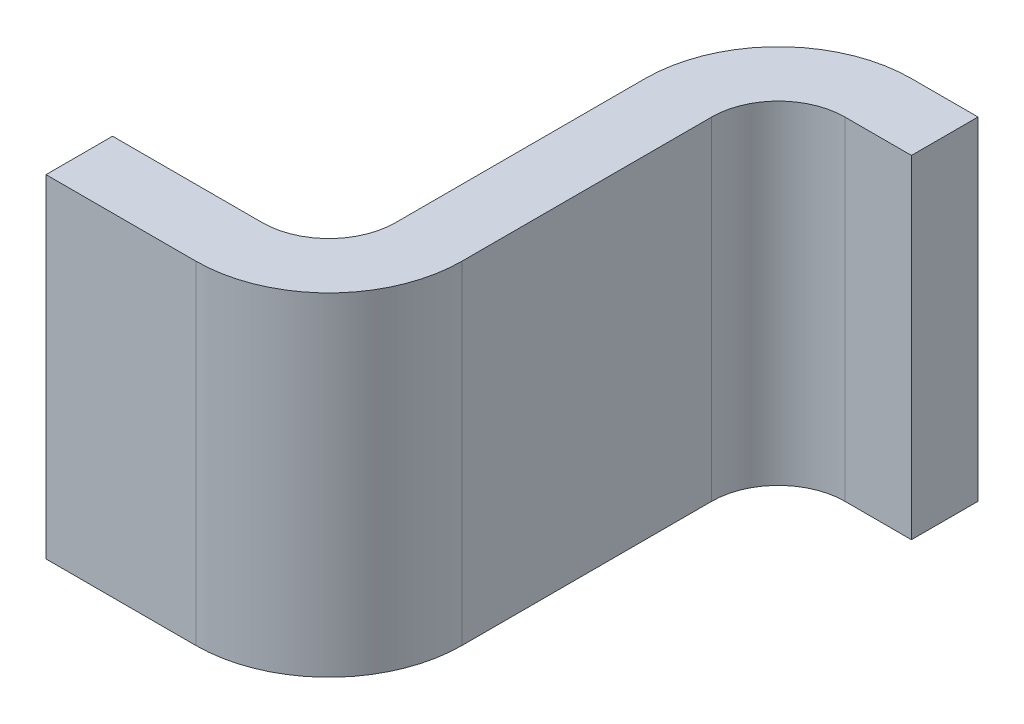
ISO-10303-21;
HEADER;
FILE_DESCRIPTION(('STEP AP214'),'2;1');
FILE_NAME('part.step','',(''),(''),'','','');
FILE_SCHEMA(('AUTOMOTIVE_DESIGN { 1 0 10303 214 1 1 1 1 }'));
ENDSEC;
DATA;
#1=APPLICATION_CONTEXT('core data for automotive mechanical design processes');
#2=APPLICATION_PROTOCOL_DEFINITION('international standard','automotive_design',2000,#1);
#3=PRODUCT_CONTEXT('',#1,'mechanical');
#4=PRODUCT('Part','Part','',(#3));
#5=PRODUCT_RELATED_PRODUCT_CATEGORY('part','',(#4));
#6=PRODUCT_DEFINITION_FORMATION('','',#4);
#7=PRODUCT_DEFINITION_CONTEXT('part definition',#1,'design');
#8=PRODUCT_DEFINITION('design','',#6,#7);
#9=PRODUCT_DEFINITION_SHAPE('','',#8);
#10=(LENGTH_UNIT() NAMED_UNIT(*) SI_UNIT(.MILLI.,.METRE.));
#11=(NAMED_UNIT(*) PLANE_ANGLE_UNIT() SI_UNIT($,.RADIAN.));
#12=(NAMED_UNIT(*) SI_UNIT($,.STERADIAN.) SOLID_ANGLE_UNIT());
#13=UNCERTAINTY_MEASURE_WITH_UNIT(LENGTH_MEASURE(1.E-05),#10,'distance_accuracy_value','');
#14=(GEOMETRIC_REPRESENTATION_CONTEXT(3) GLOBAL_UNCERTAINTY_ASSIGNED_CONTEXT((#13)) GLOBAL_UNIT_ASSIGNED_CONTEXT((#10,
#11,#12)) REPRESENTATION_CONTEXT('',''));
#15=CARTESIAN_POINT('',(0.,0.,0.));
#16=DIRECTION('',(0.,0.,1.));
#17=DIRECTION('',(1.,0.,0.));
#18=AXIS2_PLACEMENT_3D('',#15,#16,#17);
#19=CARTESIAN_POINT('',(0.,0.25,0.775));
#20=DIRECTION('',(0.,0.,-1.));
#21=DIRECTION('',(-1.,0.,0.));
#22=AXIS2_PLACEMENT_3D('',#19,#20,#21);
#23=PLANE('',#22);
#24=DIRECTION('',(1.,0.,0.));
#25=VECTOR('',#24,1.);
#26=CARTESIAN_POINT('',(0.,0.25,0.775));
#27=LINE('',#26,#25);
#28=CARTESIAN_POINT('',(0.225,0.25,0.775));
#29=VERTEX_POINT('',#28);
#30=CARTESIAN_POINT('',(0.,0.25,0.775));
#31=VERTEX_POINT('',#30);
#32=EDGE_CURVE('E85',#29,#31,#27,.F.);
#33=ORIENTED_EDGE('',*,*,#32,.T.);
#34=DIRECTION('',(0.,1.,0.));
#35=VECTOR('',#34,1.);
#36=CARTESIAN_POINT('',(0.,-0.25,0.775));
#37=LINE('',#36,#35);
#38=CARTESIAN_POINT('',(0.,-0.25,0.775));
#39=VERTEX_POINT('',#38);
#40=EDGE_CURVE('E111',#39,#31,#37,.T.);
#41=ORIENTED_EDGE('',*,*,#40,.F.);
#42=DIRECTION('',(1.,0.,0.));
#43=VECTOR('',#42,1.);
#44=CARTESIAN_POINT('',(0.,-0.25,0.775));
#45=LINE('',#44,#43);
#46=CARTESIAN_POINT('',(0.225,-0.25,0.775));
#47=VERTEX_POINT('',#46);
#48=EDGE_CURVE('E130',#39,#47,#45,.T.);
#49=ORIENTED_EDGE('',*,*,#48,.T.);
#50=DIRECTION('',(0.,1.,0.));
#51=VECTOR('',#50,1.);
#52=CARTESIAN_POINT('',(0.225,0.25,0.775));
#53=LINE('',#52,#51);
#54=EDGE_CURVE('E121',#29,#47,#53,.F.);
#55=ORIENTED_EDGE('',*,*,#54,.F.);
#56=EDGE_LOOP('',(#33,#41,#49,#55));
#57=FACE_BOUND('',#56,.T.);
#58=ADVANCED_FACE('F17',(#57),#23,.F.);
#59=CARTESIAN_POINT('',(0.525,0.25,0.1));
#60=DIRECTION('',(0.,0.,-1.));
#61=DIRECTION('',(-1.,0.,0.));
#62=AXIS2_PLACEMENT_3D('',#59,#60,#61);
#63=PLANE('',#62);
#64=DIRECTION('',(1.,0.,0.));
#65=VECTOR('',#64,1.);
#66=CARTESIAN_POINT('',(0.525,0.25,0.1));
#67=LINE('',#66,#65);
#68=CARTESIAN_POINT('',(0.625,0.25,0.1));
#69=VERTEX_POINT('',#68);
#70=CARTESIAN_POINT('',(0.525,0.25,0.1));
#71=VERTEX_POINT('',#70);
#72=EDGE_CURVE('E142',#69,#71,#67,.F.);
#73=ORIENTED_EDGE('',*,*,#72,.T.);
#74=DIRECTION('',(0.,-1.,0.));
#75=VECTOR('',#74,1.);
#76=CARTESIAN_POINT('',(0.525,0.25,0.1));
#77=LINE('',#76,#75);
#78=CARTESIAN_POINT('',(0.525,-0.25,0.1));
#79=VERTEX_POINT('',#78);
#80=EDGE_CURVE('E189',#71,#79,#77,.T.);
#81=ORIENTED_EDGE('',*,*,#80,.T.);
#82=DIRECTION('',(1.,0.,0.));
#83=VECTOR('',#82,1.);
#84=CARTESIAN_POINT('',(0.525,-0.25,0.1));
#85=LINE('',#84,#83);
#86=CARTESIAN_POINT('',(0.625,-0.25,0.1));
#87=VERTEX_POINT('',#86);
#88=EDGE_CURVE('E193',#79,#87,#85,.T.);
#89=ORIENTED_EDGE('',*,*,#88,.T.);
#90=DIRECTION('',(0.,1.,0.));
#91=VECTOR('',#90,1.);
#92=CARTESIAN_POINT('',(0.625,-0.25,0.1));
#93=LINE('',#92,#91);
#94=EDGE_CURVE('E96',#87,#69,#93,.T.);
#95=ORIENTED_EDGE('',*,*,#94,.T.);
#96=EDGE_LOOP('',(#73,#81,#89,#95));
#97=FACE_BOUND('',#96,.T.);
#98=ADVANCED_FACE('F230',(#97),#63,.F.);
#99=CARTESIAN_POINT('',(0.,-0.25,0.675));
#100=DIRECTION('',(-1.,0.,0.));
#101=DIRECTION('',(0.,0.,1.));
#102=AXIS2_PLACEMENT_3D('',#99,#100,#101);
#103=PLANE('',#102);
#104=DIRECTION('',(0.,0.,1.));
#105=VECTOR('',#104,1.);
#106=CARTESIAN_POINT('',(0.,0.25,0.675));
#107=LINE('',#106,#105);
#108=CARTESIAN_POINT('',(0.,0.25,0.675));
#109=VERTEX_POINT('',#108);
#110=EDGE_CURVE('E114',#31,#109,#107,.F.);
#111=ORIENTED_EDGE('',*,*,#110,.T.);
#112=DIRECTION('',(0.,1.,0.));
#113=VECTOR('',#112,1.);
#114=CARTESIAN_POINT('',(0.,-0.25,0.675));
#115=LINE('',#114,#113);
#116=CARTESIAN_POINT('',(0.,-0.25,0.675));
#117=VERTEX_POINT('',#116);
#118=EDGE_CURVE('E175',#109,#117,#115,.F.);
#119=ORIENTED_EDGE('',*,*,#118,.T.);
#120=DIRECTION('',(0.,0.,1.));
#121=VECTOR('',#120,1.);
#122=CARTESIAN_POINT('',(0.,-0.25,0.775));
#123=LINE('',#122,#121);
#124=EDGE_CURVE('E116',#117,#39,#123,.T.);
#125=ORIENTED_EDGE('',*,*,#124,.T.);
#126=ORIENTED_EDGE('',*,*,#40,.T.);
#127=EDGE_LOOP('',(#111,#119,#125,#126));
#128=FACE_BOUND('',#127,.T.);
#129=ADVANCED_FACE('F112',(#128),#103,.T.);
#130=CARTESIAN_POINT('',(0.225,0.25,0.575));
#131=DIRECTION('',(0.,1.,0.));
#132=DIRECTION('',(0.,0.,1.));
#133=AXIS2_PLACEMENT_3D('',#130,#131,#132);
#134=CYLINDRICAL_SURFACE('',#133,0.2);
#135=CARTESIAN_POINT('',(0.225,0.25,0.575));
#136=DIRECTION('',(0.,1.,0.));
#137=DIRECTION('',(0.,0.,1.));
#138=AXIS2_PLACEMENT_3D('',#135,#136,#137);
#139=CIRCLE('',#138,0.2);
#140=CARTESIAN_POINT('',(0.425,0.25,0.575));
#141=VERTEX_POINT('',#140);
#142=EDGE_CURVE('E20',#29,#141,#139,.T.);
#143=ORIENTED_EDGE('',*,*,#142,.F.);
#144=ORIENTED_EDGE('',*,*,#54,.T.);
#145=CARTESIAN_POINT('',(0.225,-0.25,0.575));
#146=DIRECTION('',(0.,1.,0.));
#147=DIRECTION('',(0.,0.,1.));
#148=AXIS2_PLACEMENT_3D('',#145,#146,#147);
#149=CIRCLE('',#148,0.2);
#150=CARTESIAN_POINT('',(0.425,-0.25,0.575));
#151=VERTEX_POINT('',#150);
#152=EDGE_CURVE('E166',#151,#47,#149,.F.);
#153=ORIENTED_EDGE('',*,*,#152,.F.);
#154=DIRECTION('',(0.,1.,0.));
#155=VECTOR('',#154,1.);
#156=CARTESIAN_POINT('',(0.425,0.25,0.575));
#157=LINE('',#156,#155);
#158=EDGE_CURVE('E168',#151,#141,#157,.T.);
#159=ORIENTED_EDGE('',*,*,#158,.T.);
#160=EDGE_LOOP('',(#143,#144,#153,#159));
#161=FACE_BOUND('',#160,.T.);
#162=ADVANCED_FACE('F220',(#161),#134,.T.);
#163=CARTESIAN_POINT('',(0.625,-0.25,0.));
#164=DIRECTION('',(-1.,0.,0.));
#165=DIRECTION('',(0.,0.,1.));
#166=AXIS2_PLACEMENT_3D('',#163,#164,#165);
#167=PLANE('',#166);
#168=DIRECTION('',(0.,0.,1.));
#169=VECTOR('',#168,1.);
#170=CARTESIAN_POINT('',(0.625,0.25,0.));
#171=LINE('',#170,#169);
#172=CARTESIAN_POINT('',(0.625,0.25,0.));
#173=VERTEX_POINT('',#172);
#174=EDGE_CURVE('E141',#69,#173,#171,.F.);
#175=ORIENTED_EDGE('',*,*,#174,.F.);
#176=ORIENTED_EDGE('',*,*,#94,.F.);
#177=DIRECTION('',(0.,0.,1.));
#178=VECTOR('',#177,1.);
#179=CARTESIAN_POINT('',(0.625,-0.25,0.1));
#180=LINE('',#179,#178);
#181=CARTESIAN_POINT('',(0.625,-0.25,0.));
#182=VERTEX_POINT('',#181);
#183=EDGE_CURVE('E192',#87,#182,#180,.F.);
#184=ORIENTED_EDGE('',*,*,#183,.T.);
#185=DIRECTION('',(0.,1.,0.));
#186=VECTOR('',#185,1.);
#187=CARTESIAN_POINT('',(0.625,-0.25,0.));
#188=LINE('',#187,#186);
#189=EDGE_CURVE('E161',#182,#173,#188,.T.);
#190=ORIENTED_EDGE('',*,*,#189,.T.);
#191=EDGE_LOOP('',(#175,#176,#184,#190));
#192=FACE_BOUND('',#191,.T.);
#193=ADVANCED_FACE('F232',(#192),#167,.F.);
#194=CARTESIAN_POINT('',(0.525,0.25,0.2));
#195=DIRECTION('',(0.,-1.,0.));
#196=DIRECTION('',(0.,0.,-1.));
#197=AXIS2_PLACEMENT_3D('',#194,#195,#196);
#198=CYLINDRICAL_SURFACE('',#197,0.1);
#199=CARTESIAN_POINT('',(0.525,0.25,0.2));
#200=DIRECTION('',(0.,-1.,0.));
#201=DIRECTION('',(0.,0.,-1.));
#202=AXIS2_PLACEMENT_3D('',#199,#200,#201);
#203=CIRCLE('',#202,0.1);
#204=CARTESIAN_POINT('',(0.425,0.25,0.2));
#205=VERTEX_POINT('',#204);
#206=EDGE_CURVE('E162',#205,#71,#203,.T.);
#207=ORIENTED_EDGE('',*,*,#206,.F.);
#208=DIRECTION('',(0.,1.,0.));
#209=VECTOR('',#208,1.);
#210=CARTESIAN_POINT('',(0.425,0.25,0.2));
#211=LINE('',#210,#209);
#212=CARTESIAN_POINT('',(0.425,-0.25,0.2));
#213=VERTEX_POINT('',#212);
#214=EDGE_CURVE('E165',#205,#213,#211,.F.);
#215=ORIENTED_EDGE('',*,*,#214,.T.);
#216=CARTESIAN_POINT('',(0.525,-0.25,0.2));
#217=DIRECTION('',(0.,-1.,0.));
#218=DIRECTION('',(0.,0.,-1.));
#219=AXIS2_PLACEMENT_3D('',#216,#217,#218);
#220=CIRCLE('',#219,0.1);
#221=EDGE_CURVE('E159',#79,#213,#220,.F.);
#222=ORIENTED_EDGE('',*,*,#221,.F.);
#223=ORIENTED_EDGE('',*,*,#80,.F.);
#224=EDGE_LOOP('',(#207,#215,#222,#223));
#225=FACE_BOUND('',#224,.T.);
#226=ADVANCED_FACE('F226',(#225),#198,.F.);
#227=CARTESIAN_POINT('',(0.,-0.25,0.675));
#228=DIRECTION('',(0.,0.,1.));
#229=DIRECTION('',(1.,0.,0.));
#230=AXIS2_PLACEMENT_3D('',#227,#228,#229);
#231=PLANE('',#230);
#232=DIRECTION('',(1.,0.,0.));
#233=VECTOR('',#232,1.);
#234=CARTESIAN_POINT('',(0.,-0.25,0.675));
#235=LINE('',#234,#233);
#236=CARTESIAN_POINT('',(0.225,-0.25,0.675));
#237=VERTEX_POINT('',#236);
#238=EDGE_CURVE('E169',#117,#237,#235,.T.);
#239=ORIENTED_EDGE('',*,*,#238,.F.);
#240=ORIENTED_EDGE('',*,*,#118,.F.);
#241=DIRECTION('',(1.,0.,0.));
#242=VECTOR('',#241,1.);
#243=CARTESIAN_POINT('',(0.,0.25,0.675));
#244=LINE('',#243,#242);
#245=CARTESIAN_POINT('',(0.225,0.25,0.675));
#246=VERTEX_POINT('',#245);
#247=EDGE_CURVE('E128',#246,#109,#244,.F.);
#248=ORIENTED_EDGE('',*,*,#247,.F.);
#249=DIRECTION('',(0.,1.,0.));
#250=VECTOR('',#249,1.);
#251=CARTESIAN_POINT('',(0.225,-0.25,0.675));
#252=LINE('',#251,#250);
#253=EDGE_CURVE('E155',#246,#237,#252,.F.);
#254=ORIENTED_EDGE('',*,*,#253,.T.);
#255=EDGE_LOOP('',(#239,#240,#248,#254));
#256=FACE_BOUND('',#255,.T.);
#257=ADVANCED_FACE('F266',(#256),#231,.F.);
#258=CARTESIAN_POINT('',(0.425,0.25,0.575));
#259=DIRECTION('',(-1.,0.,0.));
#260=DIRECTION('',(0.,0.,1.));
#261=AXIS2_PLACEMENT_3D('',#258,#259,#260);
#262=PLANE('',#261);
#263=DIRECTION('',(0.,0.,-1.));
#264=VECTOR('',#263,1.);
#265=CARTESIAN_POINT('',(0.425,0.25,0.575));
#266=LINE('',#265,#264);
#267=EDGE_CURVE('E158',#205,#141,#266,.F.);
#268=ORIENTED_EDGE('',*,*,#267,.T.);
#269=ORIENTED_EDGE('',*,*,#158,.F.);
#270=DIRECTION('',(0.,0.,1.));
#271=VECTOR('',#270,1.);
#272=CARTESIAN_POINT('',(0.425,-0.25,0.575));
#273=LINE('',#272,#271);
#274=EDGE_CURVE('E152',#151,#213,#273,.F.);
#275=ORIENTED_EDGE('',*,*,#274,.T.);
#276=ORIENTED_EDGE('',*,*,#214,.F.);
#277=EDGE_LOOP('',(#268,#269,#275,#276));
#278=FACE_BOUND('',#277,.T.);
#279=ADVANCED_FACE('F268',(#278),#262,.F.);
#280=CARTESIAN_POINT('',(0.525,-0.25,0.));
#281=DIRECTION('',(0.,0.,1.));
#282=DIRECTION('',(1.,0.,0.));
#283=AXIS2_PLACEMENT_3D('',#280,#281,#282);
#284=PLANE('',#283);
#285=DIRECTION('',(1.,0.,0.));
#286=VECTOR('',#285,1.);
#287=CARTESIAN_POINT('',(0.525,-0.25,0.));
#288=LINE('',#287,#286);
#289=CARTESIAN_POINT('',(0.525,-0.25,0.));
#290=VERTEX_POINT('',#289);
#291=EDGE_CURVE('E203',#290,#182,#288,.T.);
#292=ORIENTED_EDGE('',*,*,#291,.F.);
#293=DIRECTION('',(0.,-1.,0.));
#294=VECTOR('',#293,1.);
#295=CARTESIAN_POINT('',(0.525,-0.25,0.));
#296=LINE('',#295,#294);
#297=CARTESIAN_POINT('',(0.525,0.25,0.));
#298=VERTEX_POINT('',#297);
#299=EDGE_CURVE('E149',#298,#290,#296,.T.);
#300=ORIENTED_EDGE('',*,*,#299,.F.);
#301=DIRECTION('',(1.,0.,0.));
#302=VECTOR('',#301,1.);
#303=CARTESIAN_POINT('',(0.525,0.25,0.));
#304=LINE('',#303,#302);
#305=EDGE_CURVE('E164',#173,#298,#304,.F.);
#306=ORIENTED_EDGE('',*,*,#305,.F.);
#307=ORIENTED_EDGE('',*,*,#189,.F.);
#308=EDGE_LOOP('',(#292,#300,#306,#307));
#309=FACE_BOUND('',#308,.T.);
#310=ADVANCED_FACE('F238',(#309),#284,.F.);
#311=CARTESIAN_POINT('',(0.325,0.25,0.575));
#312=DIRECTION('',(0.,-1.,0.));
#313=DIRECTION('',(0.,0.,-1.));
#314=AXIS2_PLACEMENT_3D('',#311,#312,#313);
#315=PLANE('',#314);
#316=DIRECTION('',(0.,0.,-1.));
#317=VECTOR('',#316,1.);
#318=CARTESIAN_POINT('',(0.325,0.25,0.575));
#319=LINE('',#318,#317);
#320=CARTESIAN_POINT('',(0.325,0.25,0.2));
#321=VERTEX_POINT('',#320);
#322=CARTESIAN_POINT('',(0.325,0.25,0.575));
#323=VERTEX_POINT('',#322);
#324=EDGE_CURVE('E148',#321,#323,#319,.F.);
#325=ORIENTED_EDGE('',*,*,#324,.T.);
#326=CARTESIAN_POINT('',(0.225,0.25,0.575));
#327=DIRECTION('',(0.,1.,0.));
#328=DIRECTION('',(0.,0.,1.));
#329=AXIS2_PLACEMENT_3D('',#326,#327,#328);
#330=CIRCLE('',#329,0.1);
#331=EDGE_CURVE('E156',#323,#246,#330,.F.);
#332=ORIENTED_EDGE('',*,*,#331,.T.);
#333=ORIENTED_EDGE('',*,*,#247,.T.);
#334=ORIENTED_EDGE('',*,*,#110,.F.);
#335=ORIENTED_EDGE('',*,*,#32,.F.);
#336=ORIENTED_EDGE('',*,*,#142,.T.);
#337=ORIENTED_EDGE('',*,*,#267,.F.);
#338=ORIENTED_EDGE('',*,*,#206,.T.);
#339=ORIENTED_EDGE('',*,*,#72,.F.);
#340=ORIENTED_EDGE('',*,*,#174,.T.);
#341=ORIENTED_EDGE('',*,*,#305,.T.);
#342=CARTESIAN_POINT('',(0.525,0.25,0.2));
#343=DIRECTION('',(0.,-1.,0.));
#344=DIRECTION('',(0.,0.,-1.));
#345=AXIS2_PLACEMENT_3D('',#342,#343,#344);
#346=CIRCLE('',#345,0.2);
#347=EDGE_CURVE('E150',#321,#298,#346,.T.);
#348=ORIENTED_EDGE('',*,*,#347,.F.);
#349=EDGE_LOOP('',(#325,#332,#333,#334,#335,#336,#337,#338,#339,#340,#341,#348));
#350=FACE_BOUND('',#349,.T.);
#351=ADVANCED_FACE('F126',(#350),#315,.F.);
#352=CARTESIAN_POINT('',(0.225,-0.25,0.575));
#353=DIRECTION('',(0.,1.,0.));
#354=DIRECTION('',(0.,0.,1.));
#355=AXIS2_PLACEMENT_3D('',#352,#353,#354);
#356=CYLINDRICAL_SURFACE('',#355,0.1);
#357=CARTESIAN_POINT('',(0.225,-0.25,0.575));
#358=DIRECTION('',(0.,1.,0.));
#359=DIRECTION('',(0.,0.,1.));
#360=AXIS2_PLACEMENT_3D('',#357,#358,#359);
#361=CIRCLE('',#360,0.1);
#362=CARTESIAN_POINT('',(0.325,-0.25,0.575));
#363=VERTEX_POINT('',#362);
#364=EDGE_CURVE('E153',#237,#363,#361,.T.);
#365=ORIENTED_EDGE('',*,*,#364,.F.);
#366=ORIENTED_EDGE('',*,*,#253,.F.);
#367=ORIENTED_EDGE('',*,*,#331,.F.);
#368=DIRECTION('',(0.,1.,0.));
#369=VECTOR('',#368,1.);
#370=CARTESIAN_POINT('',(0.325,-0.25,0.575));
#371=LINE('',#370,#369);
#372=EDGE_CURVE('E251',#323,#363,#371,.F.);
#373=ORIENTED_EDGE('',*,*,#372,.T.);
#374=EDGE_LOOP('',(#365,#366,#367,#373));
#375=FACE_BOUND('',#374,.T.);
#376=ADVANCED_FACE('F263',(#375),#356,.F.);
#377=CARTESIAN_POINT('',(0.425,-0.25,0.575));
#378=DIRECTION('',(0.,1.,0.));
#379=DIRECTION('',(0.,0.,1.));
#380=AXIS2_PLACEMENT_3D('',#377,#378,#379);
#381=PLANE('',#380);
#382=ORIENTED_EDGE('',*,*,#274,.F.);
#383=ORIENTED_EDGE('',*,*,#152,.T.);
#384=ORIENTED_EDGE('',*,*,#48,.F.);
#385=ORIENTED_EDGE('',*,*,#124,.F.);
#386=ORIENTED_EDGE('',*,*,#238,.T.);
#387=ORIENTED_EDGE('',*,*,#364,.T.);
#388=DIRECTION('',(0.,0.,-1.));
#389=VECTOR('',#388,1.);
#390=CARTESIAN_POINT('',(0.325,-0.25,0.575));
#391=LINE('',#390,#389);
#392=CARTESIAN_POINT('',(0.325,-0.25,0.2));
#393=VERTEX_POINT('',#392);
#394=EDGE_CURVE('E26',#363,#393,#391,.T.);
#395=ORIENTED_EDGE('',*,*,#394,.T.);
#396=CARTESIAN_POINT('',(0.525,-0.25,0.2));
#397=DIRECTION('',(0.,-1.,0.));
#398=DIRECTION('',(0.,0.,-1.));
#399=AXIS2_PLACEMENT_3D('',#396,#397,#398);
#400=CIRCLE('',#399,0.2);
#401=EDGE_CURVE('E34',#290,#393,#400,.F.);
#402=ORIENTED_EDGE('',*,*,#401,.F.);
#403=ORIENTED_EDGE('',*,*,#291,.T.);
#404=ORIENTED_EDGE('',*,*,#183,.F.);
#405=ORIENTED_EDGE('',*,*,#88,.F.);
#406=ORIENTED_EDGE('',*,*,#221,.T.);
#407=EDGE_LOOP('',(#382,#383,#384,#385,#386,#387,#395,#402,#403,#404,#405,#406));
#408=FACE_BOUND('',#407,.T.);
#409=ADVANCED_FACE('F240',(#408),#381,.F.);
#410=CARTESIAN_POINT('',(0.525,-0.25,0.2));
#411=DIRECTION('',(0.,-1.,0.));
#412=DIRECTION('',(0.,0.,-1.));
#413=AXIS2_PLACEMENT_3D('',#410,#411,#412);
#414=CYLINDRICAL_SURFACE('',#413,0.2);
#415=ORIENTED_EDGE('',*,*,#401,.T.);
#416=DIRECTION('',(0.,1.,0.));
#417=VECTOR('',#416,1.);
#418=CARTESIAN_POINT('',(0.325,-0.25,0.2));
#419=LINE('',#418,#417);
#420=EDGE_CURVE('E11',#393,#321,#419,.T.);
#421=ORIENTED_EDGE('',*,*,#420,.T.);
#422=ORIENTED_EDGE('',*,*,#347,.T.);
#423=ORIENTED_EDGE('',*,*,#299,.T.);
#424=EDGE_LOOP('',(#415,#421,#422,#423));
#425=FACE_BOUND('',#424,.T.);
#426=ADVANCED_FACE('F260',(#425),#414,.T.);
#427=CARTESIAN_POINT('',(0.325,-0.25,0.575));
#428=DIRECTION('',(1.,0.,0.));
#429=DIRECTION('',(0.,0.,-1.));
#430=AXIS2_PLACEMENT_3D('',#427,#428,#429);
#431=PLANE('',#430);
#432=ORIENTED_EDGE('',*,*,#394,.F.);
#433=ORIENTED_EDGE('',*,*,#372,.F.);
#434=ORIENTED_EDGE('',*,*,#324,.F.);
#435=ORIENTED_EDGE('',*,*,#420,.F.);
#436=EDGE_LOOP('',(#432,#433,#434,#435));
#437=FACE_BOUND('',#436,.T.);
#438=ADVANCED_FACE('F258',(#437),#431,.F.);
#439=CLOSED_SHELL('',(#58,#98,#129,#162,#193,#226,#257,#279,#310,#351,#376,#409,#426,#438));
#440=MANIFOLD_SOLID_BREP('B1',#439);
#441=ADVANCED_BREP_SHAPE_REPRESENTATION('',(#18,#440),#14);
#442=SHAPE_DEFINITION_REPRESENTATION(#9,#441);
ENDSEC;
END-ISO-10303-21;
